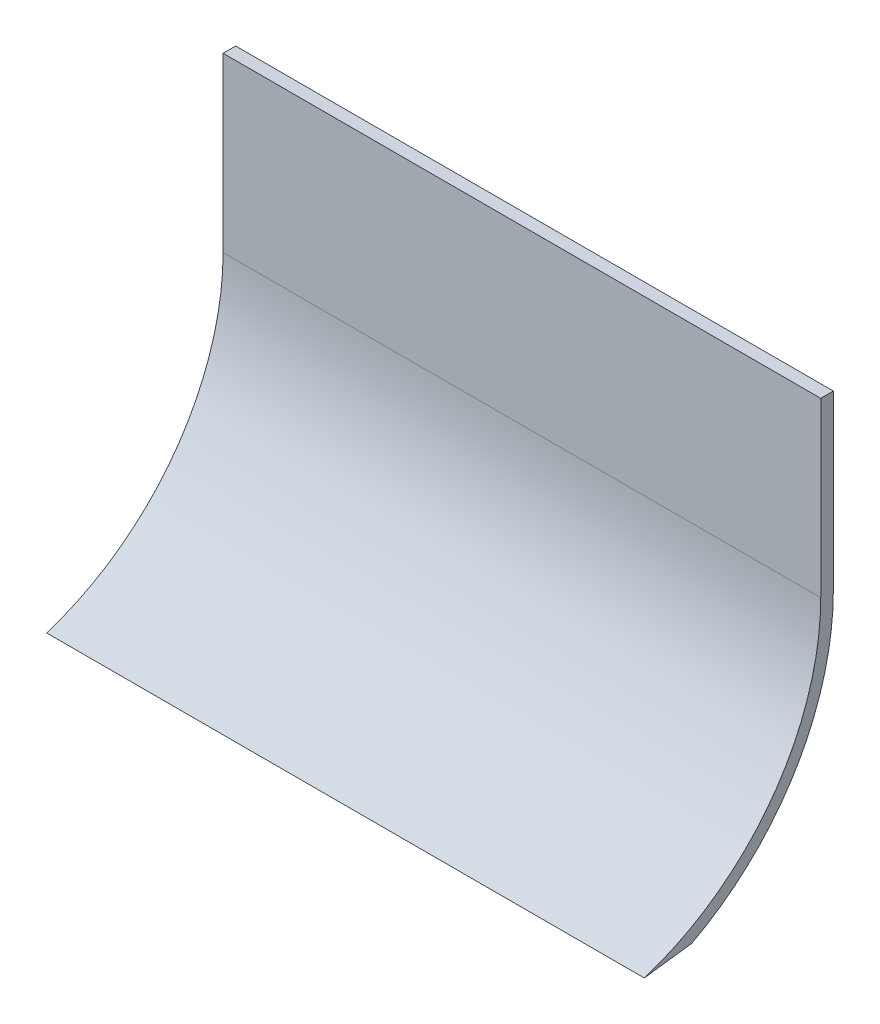
ISO-10303-21;
HEADER;
FILE_DESCRIPTION(('STEP AP214'),'2;1');
FILE_NAME('part.step','',(''),(''),'','','');
FILE_SCHEMA(('AUTOMOTIVE_DESIGN { 1 0 10303 214 1 1 1 1 }'));
ENDSEC;
DATA;
#1=APPLICATION_CONTEXT('core data for automotive mechanical design processes');
#2=APPLICATION_PROTOCOL_DEFINITION('international standard','automotive_design',2000,#1);
#3=PRODUCT_CONTEXT('',#1,'mechanical');
#4=PRODUCT('Part','Part','',(#3));
#5=PRODUCT_RELATED_PRODUCT_CATEGORY('part','',(#4));
#6=PRODUCT_DEFINITION_FORMATION('','',#4);
#7=PRODUCT_DEFINITION_CONTEXT('part definition',#1,'design');
#8=PRODUCT_DEFINITION('design','',#6,#7);
#9=PRODUCT_DEFINITION_SHAPE('','',#8);
#10=(LENGTH_UNIT() NAMED_UNIT(*) SI_UNIT(.MILLI.,.METRE.));
#11=(NAMED_UNIT(*) PLANE_ANGLE_UNIT() SI_UNIT($,.RADIAN.));
#12=(NAMED_UNIT(*) SI_UNIT($,.STERADIAN.) SOLID_ANGLE_UNIT());
#13=UNCERTAINTY_MEASURE_WITH_UNIT(LENGTH_MEASURE(1.E-05),#10,'distance_accuracy_value','');
#14=(GEOMETRIC_REPRESENTATION_CONTEXT(3) GLOBAL_UNCERTAINTY_ASSIGNED_CONTEXT((#13)) GLOBAL_UNIT_ASSIGNED_CONTEXT((#10,
#11,#12)) REPRESENTATION_CONTEXT('',''));
#15=CARTESIAN_POINT('',(0.,0.,0.));
#16=DIRECTION('',(0.,0.,1.));
#17=DIRECTION('',(1.,0.,0.));
#18=AXIS2_PLACEMENT_3D('',#15,#16,#17);
#19=CARTESIAN_POINT('',(50.,0.,0.));
#20=DIRECTION('',(-1.,0.,0.));
#21=DIRECTION('',(0.,0.,1.));
#22=AXIS2_PLACEMENT_3D('',#19,#20,#21);
#23=CYLINDRICAL_SURFACE('',#22,44.45);
#24=CARTESIAN_POINT('',(-50.,0.,0.));
#25=DIRECTION('',(1.,0.,0.));
#26=DIRECTION('',(0.,0.,1.));
#27=AXIS2_PLACEMENT_3D('',#24,#25,#26);
#28=CIRCLE('',#27,44.45);
#29=CARTESIAN_POINT('',(-50.,-39.3112994705029,-20.7466680202012));
#30=VERTEX_POINT('',#29);
#31=CARTESIAN_POINT('',(-50.,0.,-44.45));
#32=VERTEX_POINT('',#31);
#33=EDGE_CURVE('E118',#30,#32,#28,.T.);
#34=ORIENTED_EDGE('',*,*,#33,.T.);
#35=DIRECTION('',(-1.,0.,0.));
#36=VECTOR('',#35,1.);
#37=CARTESIAN_POINT('',(50.,0.,-44.45));
#38=LINE('',#37,#36);
#39=CARTESIAN_POINT('',(50.,0.,-44.45));
#40=VERTEX_POINT('',#39);
#41=EDGE_CURVE('E11',#40,#32,#38,.T.);
#42=ORIENTED_EDGE('',*,*,#41,.F.);
#43=CARTESIAN_POINT('',(50.,0.,0.));
#44=DIRECTION('',(1.,0.,0.));
#45=DIRECTION('',(0.,0.,1.));
#46=AXIS2_PLACEMENT_3D('',#43,#44,#45);
#47=CIRCLE('',#46,44.45);
#48=CARTESIAN_POINT('',(50.,-39.3112994705029,-20.7466680202012));
#49=VERTEX_POINT('',#48);
#50=EDGE_CURVE('E128',#49,#40,#47,.T.);
#51=ORIENTED_EDGE('',*,*,#50,.F.);
#52=DIRECTION('',(-1.,0.,0.));
#53=VECTOR('',#52,1.);
#54=CARTESIAN_POINT('',(50.,-39.3112994705029,-20.7466680202012));
#55=LINE('',#54,#53);
#56=EDGE_CURVE('E114',#49,#30,#55,.T.);
#57=ORIENTED_EDGE('',*,*,#56,.T.);
#58=EDGE_LOOP('',(#34,#42,#51,#57));
#59=FACE_BOUND('',#58,.T.);
#60=ADVANCED_FACE('F34',(#59),#23,.T.);
#61=CARTESIAN_POINT('',(50.,0.,-44.45));
#62=DIRECTION('',(0.,0.,1.));
#63=DIRECTION('',(1.,0.,0.));
#64=AXIS2_PLACEMENT_3D('',#61,#62,#63);
#65=PLANE('',#64);
#66=DIRECTION('',(0.,1.,0.));
#67=VECTOR('',#66,1.);
#68=CARTESIAN_POINT('',(-50.,0.,-44.45));
#69=LINE('',#68,#67);
#70=CARTESIAN_POINT('',(-50.,28.8781708122769,-44.45));
#71=VERTEX_POINT('',#70);
#72=EDGE_CURVE('E121',#32,#71,#69,.T.);
#73=ORIENTED_EDGE('',*,*,#72,.T.);
#74=DIRECTION('',(-1.,0.,0.));
#75=VECTOR('',#74,1.);
#76=CARTESIAN_POINT('',(50.,28.8781708122769,-44.45));
#77=LINE('',#76,#75);
#78=CARTESIAN_POINT('',(50.,28.8781708122769,-44.45));
#79=VERTEX_POINT('',#78);
#80=EDGE_CURVE('E42',#79,#71,#77,.T.);
#81=ORIENTED_EDGE('',*,*,#80,.F.);
#82=DIRECTION('',(0.,1.,0.));
#83=VECTOR('',#82,1.);
#84=CARTESIAN_POINT('',(50.,0.,-44.45));
#85=LINE('',#84,#83);
#86=EDGE_CURVE('E87',#40,#79,#85,.T.);
#87=ORIENTED_EDGE('',*,*,#86,.F.);
#88=ORIENTED_EDGE('',*,*,#41,.T.);
#89=EDGE_LOOP('',(#73,#81,#87,#88));
#90=FACE_BOUND('',#89,.T.);
#91=ADVANCED_FACE('F152',(#90),#65,.F.);
#92=CARTESIAN_POINT('',(50.,28.8781708122769,-44.45));
#93=DIRECTION('',(0.,-1.,0.));
#94=DIRECTION('',(0.,0.,-1.));
#95=AXIS2_PLACEMENT_3D('',#92,#93,#94);
#96=PLANE('',#95);
#97=DIRECTION('',(0.,0.,1.));
#98=VECTOR('',#97,1.);
#99=CARTESIAN_POINT('',(-50.,28.8781708122769,-44.45));
#100=LINE('',#99,#98);
#101=CARTESIAN_POINT('',(-50.,28.8781708122769,-42.34));
#102=VERTEX_POINT('',#101);
#103=EDGE_CURVE('E123',#71,#102,#100,.T.);
#104=ORIENTED_EDGE('',*,*,#103,.T.);
#105=DIRECTION('',(-1.,0.,0.));
#106=VECTOR('',#105,1.);
#107=CARTESIAN_POINT('',(50.,28.8781708122769,-42.34));
#108=LINE('',#107,#106);
#109=CARTESIAN_POINT('',(50.,28.8781708122769,-42.34));
#110=VERTEX_POINT('',#109);
#111=EDGE_CURVE('E109',#110,#102,#108,.T.);
#112=ORIENTED_EDGE('',*,*,#111,.F.);
#113=DIRECTION('',(0.,0.,1.));
#114=VECTOR('',#113,1.);
#115=CARTESIAN_POINT('',(50.,28.8781708122769,-44.45));
#116=LINE('',#115,#114);
#117=EDGE_CURVE('E100',#79,#110,#116,.T.);
#118=ORIENTED_EDGE('',*,*,#117,.F.);
#119=ORIENTED_EDGE('',*,*,#80,.T.);
#120=EDGE_LOOP('',(#104,#112,#118,#119));
#121=FACE_BOUND('',#120,.T.);
#122=ADVANCED_FACE('F134',(#121),#96,.F.);
#123=CARTESIAN_POINT('',(50.,0.,-42.34));
#124=DIRECTION('',(0.,0.,-1.));
#125=DIRECTION('',(-1.,0.,0.));
#126=AXIS2_PLACEMENT_3D('',#123,#124,#125);
#127=PLANE('',#126);
#128=DIRECTION('',(0.,-1.,0.));
#129=VECTOR('',#128,1.);
#130=CARTESIAN_POINT('',(-50.,0.,-42.34));
#131=LINE('',#130,#129);
#132=CARTESIAN_POINT('',(-50.,0.,-42.34));
#133=VERTEX_POINT('',#132);
#134=EDGE_CURVE('E108',#102,#133,#131,.T.);
#135=ORIENTED_EDGE('',*,*,#134,.T.);
#136=DIRECTION('',(-1.,0.,0.));
#137=VECTOR('',#136,1.);
#138=CARTESIAN_POINT('',(50.,0.,-42.34));
#139=LINE('',#138,#137);
#140=CARTESIAN_POINT('',(50.,0.,-42.34));
#141=VERTEX_POINT('',#140);
#142=EDGE_CURVE('E105',#141,#133,#139,.T.);
#143=ORIENTED_EDGE('',*,*,#142,.F.);
#144=DIRECTION('',(0.,-1.,0.));
#145=VECTOR('',#144,1.);
#146=CARTESIAN_POINT('',(50.,0.,-42.34));
#147=LINE('',#146,#145);
#148=EDGE_CURVE('E94',#110,#141,#147,.T.);
#149=ORIENTED_EDGE('',*,*,#148,.F.);
#150=ORIENTED_EDGE('',*,*,#111,.T.);
#151=EDGE_LOOP('',(#135,#143,#149,#150));
#152=FACE_BOUND('',#151,.T.);
#153=ADVANCED_FACE('F106',(#152),#127,.F.);
#154=CARTESIAN_POINT('',(50.,0.,0.));
#155=DIRECTION('',(-1.,0.,0.));
#156=DIRECTION('',(0.,0.,1.));
#157=AXIS2_PLACEMENT_3D('',#154,#155,#156);
#158=CYLINDRICAL_SURFACE('',#157,42.34);
#159=CARTESIAN_POINT('',(-50.,0.,0.));
#160=DIRECTION('',(-1.,0.,0.));
#161=DIRECTION('',(0.,0.,1.));
#162=AXIS2_PLACEMENT_3D('',#159,#160,#161);
#163=CIRCLE('',#162,42.34);
#164=CARTESIAN_POINT('',(-50.,-40.354099313617,-12.8149236668322));
#165=VERTEX_POINT('',#164);
#166=EDGE_CURVE('E73',#133,#165,#163,.T.);
#167=ORIENTED_EDGE('',*,*,#166,.T.);
#168=DIRECTION('',(-1.,0.,0.));
#169=VECTOR('',#168,1.);
#170=CARTESIAN_POINT('',(50.,-40.354099313617,-12.8149236668322));
#171=LINE('',#170,#169);
#172=CARTESIAN_POINT('',(50.,-40.354099313617,-12.8149236668322));
#173=VERTEX_POINT('',#172);
#174=EDGE_CURVE('E110',#173,#165,#171,.T.);
#175=ORIENTED_EDGE('',*,*,#174,.F.);
#176=CARTESIAN_POINT('',(50.,0.,0.));
#177=DIRECTION('',(-1.,0.,0.));
#178=DIRECTION('',(0.,0.,1.));
#179=AXIS2_PLACEMENT_3D('',#176,#177,#178);
#180=CIRCLE('',#179,42.34);
#181=EDGE_CURVE('E98',#141,#173,#180,.T.);
#182=ORIENTED_EDGE('',*,*,#181,.F.);
#183=ORIENTED_EDGE('',*,*,#142,.T.);
#184=EDGE_LOOP('',(#167,#175,#182,#183));
#185=FACE_BOUND('',#184,.T.);
#186=ADVANCED_FACE('F112',(#185),#158,.F.);
#187=CARTESIAN_POINT('',(50.,-40.354099313617,-12.8149236668322));
#188=DIRECTION('',(0.,0.991468044171126,0.130349980389265));
#189=DIRECTION('',(0.,-0.130349980389265,0.991468044171126));
#190=AXIS2_PLACEMENT_3D('',#187,#188,#189);
#191=PLANE('',#190);
#192=DIRECTION('',(0.,0.130349980389265,-0.991468044171126));
#193=VECTOR('',#192,1.);
#194=CARTESIAN_POINT('',(-50.,-40.354099313617,-12.8149236668322));
#195=LINE('',#194,#193);
#196=EDGE_CURVE('E79',#165,#30,#195,.T.);
#197=ORIENTED_EDGE('',*,*,#196,.T.);
#198=ORIENTED_EDGE('',*,*,#56,.F.);
#199=DIRECTION('',(0.,0.130349980389265,-0.991468044171126));
#200=VECTOR('',#199,1.);
#201=CARTESIAN_POINT('',(50.,-40.354099313617,-12.8149236668322));
#202=LINE('',#201,#200);
#203=EDGE_CURVE('E50',#173,#49,#202,.T.);
#204=ORIENTED_EDGE('',*,*,#203,.F.);
#205=ORIENTED_EDGE('',*,*,#174,.T.);
#206=EDGE_LOOP('',(#197,#198,#204,#205));
#207=FACE_BOUND('',#206,.T.);
#208=ADVANCED_FACE('F141',(#207),#191,.F.);
#209=CARTESIAN_POINT('',(50.,0.,0.));
#210=DIRECTION('',(-1.,0.,0.));
#211=DIRECTION('',(0.,0.,1.));
#212=AXIS2_PLACEMENT_3D('',#209,#210,#211);
#213=PLANE('',#212);
#214=ORIENTED_EDGE('',*,*,#50,.T.);
#215=ORIENTED_EDGE('',*,*,#86,.T.);
#216=ORIENTED_EDGE('',*,*,#117,.T.);
#217=ORIENTED_EDGE('',*,*,#148,.T.);
#218=ORIENTED_EDGE('',*,*,#181,.T.);
#219=ORIENTED_EDGE('',*,*,#203,.T.);
#220=EDGE_LOOP('',(#214,#215,#216,#217,#218,#219));
#221=FACE_BOUND('',#220,.T.);
#222=ADVANCED_FACE('F96',(#221),#213,.F.);
#223=CARTESIAN_POINT('',(-50.,0.,0.));
#224=DIRECTION('',(-1.,0.,0.));
#225=DIRECTION('',(0.,0.,1.));
#226=AXIS2_PLACEMENT_3D('',#223,#224,#225);
#227=PLANE('',#226);
#228=ORIENTED_EDGE('',*,*,#33,.F.);
#229=ORIENTED_EDGE('',*,*,#196,.F.);
#230=ORIENTED_EDGE('',*,*,#166,.F.);
#231=ORIENTED_EDGE('',*,*,#134,.F.);
#232=ORIENTED_EDGE('',*,*,#103,.F.);
#233=ORIENTED_EDGE('',*,*,#72,.F.);
#234=EDGE_LOOP('',(#228,#229,#230,#231,#232,#233));
#235=FACE_BOUND('',#234,.T.);
#236=ADVANCED_FACE('F137',(#235),#227,.T.);
#237=CLOSED_SHELL('',(#60,#91,#122,#153,#186,#208,#222,#236));
#238=MANIFOLD_SOLID_BREP('B2',#237);
#239=ADVANCED_BREP_SHAPE_REPRESENTATION('',(#18,#238),#14);
#240=SHAPE_DEFINITION_REPRESENTATION(#9,#239);
ENDSEC;
END-ISO-10303-21;
